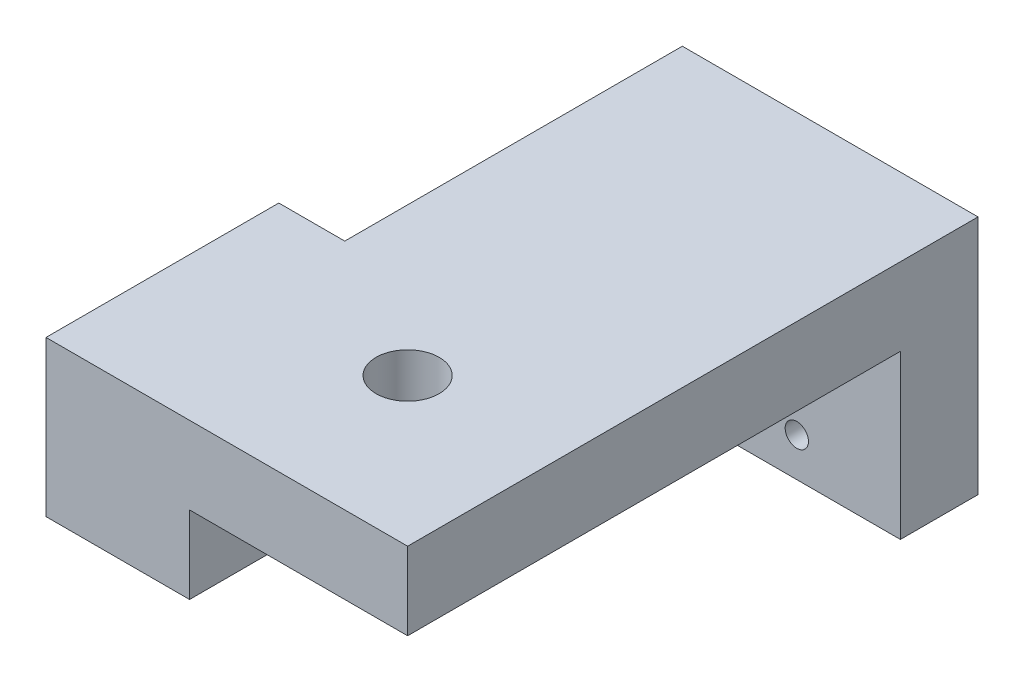
ISO-10303-21;
HEADER;
FILE_DESCRIPTION(('STEP AP214'),'2;1');
FILE_NAME('part.step','',(''),(''),'','','');
FILE_SCHEMA(('AUTOMOTIVE_DESIGN { 1 0 10303 214 1 1 1 1 }'));
ENDSEC;
DATA;
#1=APPLICATION_CONTEXT('core data for automotive mechanical design processes');
#2=APPLICATION_PROTOCOL_DEFINITION('international standard','automotive_design',2000,#1);
#3=PRODUCT_CONTEXT('',#1,'mechanical');
#4=PRODUCT('Part','Part','',(#3));
#5=PRODUCT_RELATED_PRODUCT_CATEGORY('part','',(#4));
#6=PRODUCT_DEFINITION_FORMATION('','',#4);
#7=PRODUCT_DEFINITION_CONTEXT('part definition',#1,'design');
#8=PRODUCT_DEFINITION('design','',#6,#7);
#9=PRODUCT_DEFINITION_SHAPE('','',#8);
#10=(LENGTH_UNIT() NAMED_UNIT(*) SI_UNIT(.MILLI.,.METRE.));
#11=(NAMED_UNIT(*) PLANE_ANGLE_UNIT() SI_UNIT($,.RADIAN.));
#12=(NAMED_UNIT(*) SI_UNIT($,.STERADIAN.) SOLID_ANGLE_UNIT());
#13=UNCERTAINTY_MEASURE_WITH_UNIT(LENGTH_MEASURE(1.E-05),#10,'distance_accuracy_value','');
#14=(GEOMETRIC_REPRESENTATION_CONTEXT(3) GLOBAL_UNCERTAINTY_ASSIGNED_CONTEXT((#13)) GLOBAL_UNIT_ASSIGNED_CONTEXT((#10,
#11,#12)) REPRESENTATION_CONTEXT('',''));
#15=CARTESIAN_POINT('',(0.,0.,0.));
#16=DIRECTION('',(0.,0.,1.));
#17=DIRECTION('',(1.,0.,0.));
#18=AXIS2_PLACEMENT_3D('',#15,#16,#17);
#19=CARTESIAN_POINT('',(0.,10.,0.));
#20=DIRECTION('',(0.,1.,0.));
#21=DIRECTION('',(0.,0.,1.));
#22=AXIS2_PLACEMENT_3D('',#19,#20,#21);
#23=PLANE('',#22);
#24=DIRECTION('',(0.,0.,1.));
#25=VECTOR('',#24,1.);
#26=CARTESIAN_POINT('',(0.,10.,0.));
#27=LINE('',#26,#25);
#28=CARTESIAN_POINT('',(0.,10.,-10.));
#29=VERTEX_POINT('',#28);
#30=CARTESIAN_POINT('',(0.,10.,33.5));
#31=VERTEX_POINT('',#30);
#32=EDGE_CURVE('E259',#29,#31,#27,.T.);
#33=ORIENTED_EDGE('',*,*,#32,.T.);
#34=DIRECTION('',(1.,0.,0.));
#35=VECTOR('',#34,1.);
#36=CARTESIAN_POINT('',(-8.5,10.,33.5));
#37=LINE('',#36,#35);
#38=CARTESIAN_POINT('',(-8.5,10.,33.5));
#39=VERTEX_POINT('',#38);
#40=EDGE_CURVE('E73',#39,#31,#37,.T.);
#41=ORIENTED_EDGE('',*,*,#40,.F.);
#42=DIRECTION('',(0.,0.,1.));
#43=VECTOR('',#42,1.);
#44=CARTESIAN_POINT('',(-8.5,10.,63.5));
#45=LINE('',#44,#43);
#46=CARTESIAN_POINT('',(-8.5,10.,63.5));
#47=VERTEX_POINT('',#46);
#48=EDGE_CURVE('E240',#39,#47,#45,.T.);
#49=ORIENTED_EDGE('',*,*,#48,.T.);
#50=DIRECTION('',(1.,0.,0.));
#51=VECTOR('',#50,1.);
#52=CARTESIAN_POINT('',(0.,10.,63.5));
#53=LINE('',#52,#51);
#54=CARTESIAN_POINT('',(38.1,10.,63.5));
#55=VERTEX_POINT('',#54);
#56=EDGE_CURVE('E51',#47,#55,#53,.T.);
#57=ORIENTED_EDGE('',*,*,#56,.T.);
#58=DIRECTION('',(0.,0.,-1.));
#59=VECTOR('',#58,1.);
#60=CARTESIAN_POINT('',(38.1,10.,0.));
#61=LINE('',#60,#59);
#62=CARTESIAN_POINT('',(38.1,10.,-10.));
#63=VERTEX_POINT('',#62);
#64=EDGE_CURVE('E264',#55,#63,#61,.T.);
#65=ORIENTED_EDGE('',*,*,#64,.T.);
#66=DIRECTION('',(1.,0.,0.));
#67=VECTOR('',#66,1.);
#68=CARTESIAN_POINT('',(0.,10.,-10.));
#69=LINE('',#68,#67);
#70=EDGE_CURVE('E177',#29,#63,#69,.T.);
#71=ORIENTED_EDGE('',*,*,#70,.F.);
#72=EDGE_LOOP('',(#33,#41,#49,#57,#65,#71));
#73=FACE_BOUND('',#72,.T.);
#74=CARTESIAN_POINT('',(19.05,10.,44.45));
#75=DIRECTION('',(0.,1.,0.));
#76=DIRECTION('',(0.,0.,1.));
#77=AXIS2_PLACEMENT_3D('',#74,#75,#76);
#78=CIRCLE('',#77,4.064);
#79=CARTESIAN_POINT('',(19.05,10.,48.514));
#80=VERTEX_POINT('',#79);
#81=EDGE_CURVE('E253',#80,#80,#78,.T.);
#82=ORIENTED_EDGE('',*,*,#81,.F.);
#83=EDGE_LOOP('',(#82));
#84=FACE_BOUND('',#83,.T.);
#85=ADVANCED_FACE('F35',(#73,#84),#23,.T.);
#86=CARTESIAN_POINT('',(0.,0.,0.));
#87=DIRECTION('',(0.,1.,0.));
#88=DIRECTION('',(0.,0.,1.));
#89=AXIS2_PLACEMENT_3D('',#86,#87,#88);
#90=PLANE('',#89);
#91=DIRECTION('',(0.,0.,1.));
#92=VECTOR('',#91,1.);
#93=CARTESIAN_POINT('',(10.,0.,0.));
#94=LINE('',#93,#92);
#95=CARTESIAN_POINT('',(10.,0.,33.5));
#96=VERTEX_POINT('',#95);
#97=CARTESIAN_POINT('',(10.,0.,63.5));
#98=VERTEX_POINT('',#97);
#99=EDGE_CURVE('E244',#96,#98,#94,.T.);
#100=ORIENTED_EDGE('',*,*,#99,.F.);
#101=DIRECTION('',(-1.,0.,0.));
#102=VECTOR('',#101,1.);
#103=CARTESIAN_POINT('',(0.,0.,33.5));
#104=LINE('',#103,#102);
#105=CARTESIAN_POINT('',(0.,0.,33.5));
#106=VERTEX_POINT('',#105);
#107=EDGE_CURVE('E250',#96,#106,#104,.T.);
#108=ORIENTED_EDGE('',*,*,#107,.T.);
#109=DIRECTION('',(0.,0.,1.));
#110=VECTOR('',#109,1.);
#111=CARTESIAN_POINT('',(0.,0.,0.));
#112=LINE('',#111,#110);
#113=CARTESIAN_POINT('',(0.,0.,0.));
#114=VERTEX_POINT('',#113);
#115=EDGE_CURVE('E256',#114,#106,#112,.T.);
#116=ORIENTED_EDGE('',*,*,#115,.F.);
#117=DIRECTION('',(-1.,0.,0.));
#118=VECTOR('',#117,1.);
#119=CARTESIAN_POINT('',(0.,0.,0.));
#120=LINE('',#119,#118);
#121=CARTESIAN_POINT('',(38.1,0.,0.));
#122=VERTEX_POINT('',#121);
#123=EDGE_CURVE('E262',#122,#114,#120,.T.);
#124=ORIENTED_EDGE('',*,*,#123,.F.);
#125=DIRECTION('',(0.,0.,-1.));
#126=VECTOR('',#125,1.);
#127=CARTESIAN_POINT('',(38.1,0.,0.));
#128=LINE('',#127,#126);
#129=CARTESIAN_POINT('',(38.1,0.,63.5));
#130=VERTEX_POINT('',#129);
#131=EDGE_CURVE('E269',#130,#122,#128,.T.);
#132=ORIENTED_EDGE('',*,*,#131,.F.);
#133=DIRECTION('',(1.,0.,0.));
#134=VECTOR('',#133,1.);
#135=CARTESIAN_POINT('',(0.,0.,63.5));
#136=LINE('',#135,#134);
#137=EDGE_CURVE('E62',#98,#130,#136,.T.);
#138=ORIENTED_EDGE('',*,*,#137,.F.);
#139=EDGE_LOOP('',(#100,#108,#116,#124,#132,#138));
#140=FACE_BOUND('',#139,.T.);
#141=CARTESIAN_POINT('',(19.05,0.,44.45));
#142=DIRECTION('',(0.,1.,0.));
#143=DIRECTION('',(0.,0.,1.));
#144=AXIS2_PLACEMENT_3D('',#141,#142,#143);
#145=CIRCLE('',#144,4.064);
#146=CARTESIAN_POINT('',(19.05,0.,48.514));
#147=VERTEX_POINT('',#146);
#148=EDGE_CURVE('E252',#147,#147,#145,.T.);
#149=ORIENTED_EDGE('',*,*,#148,.T.);
#150=EDGE_LOOP('',(#149));
#151=FACE_BOUND('',#150,.T.);
#152=ADVANCED_FACE('F280',(#140,#151),#90,.F.);
#153=CARTESIAN_POINT('',(0.,10.,0.));
#154=DIRECTION('',(1.,0.,0.));
#155=DIRECTION('',(0.,0.,-1.));
#156=AXIS2_PLACEMENT_3D('',#153,#154,#155);
#157=PLANE('',#156);
#158=ORIENTED_EDGE('',*,*,#115,.T.);
#159=DIRECTION('',(0.,1.,0.));
#160=VECTOR('',#159,1.);
#161=CARTESIAN_POINT('',(0.,10.,33.5));
#162=LINE('',#161,#160);
#163=EDGE_CURVE('E11',#106,#31,#162,.T.);
#164=ORIENTED_EDGE('',*,*,#163,.T.);
#165=ORIENTED_EDGE('',*,*,#32,.F.);
#166=DIRECTION('',(0.,-1.,0.));
#167=VECTOR('',#166,1.);
#168=CARTESIAN_POINT('',(0.,0.,-10.));
#169=LINE('',#168,#167);
#170=CARTESIAN_POINT('',(0.,-21.,-10.));
#171=VERTEX_POINT('',#170);
#172=EDGE_CURVE('E180',#29,#171,#169,.T.);
#173=ORIENTED_EDGE('',*,*,#172,.T.);
#174=DIRECTION('',(0.,0.,1.));
#175=VECTOR('',#174,1.);
#176=CARTESIAN_POINT('',(0.,-21.,-10.));
#177=LINE('',#176,#175);
#178=CARTESIAN_POINT('',(0.,-21.,0.));
#179=VERTEX_POINT('',#178);
#180=EDGE_CURVE('E210',#171,#179,#177,.T.);
#181=ORIENTED_EDGE('',*,*,#180,.T.);
#182=DIRECTION('',(0.,-1.,0.));
#183=VECTOR('',#182,1.);
#184=CARTESIAN_POINT('',(0.,0.,0.));
#185=LINE('',#184,#183);
#186=EDGE_CURVE('E200',#114,#179,#185,.T.);
#187=ORIENTED_EDGE('',*,*,#186,.F.);
#188=EDGE_LOOP('',(#158,#164,#165,#173,#181,#187));
#189=FACE_BOUND('',#188,.T.);
#190=ADVANCED_FACE('F37',(#189),#157,.F.);
#191=CARTESIAN_POINT('',(0.,10.,63.5));
#192=DIRECTION('',(0.,0.,-1.));
#193=DIRECTION('',(-1.,0.,0.));
#194=AXIS2_PLACEMENT_3D('',#191,#192,#193);
#195=PLANE('',#194);
#196=DIRECTION('',(0.,-1.,0.));
#197=VECTOR('',#196,1.);
#198=CARTESIAN_POINT('',(10.,0.,63.5));
#199=LINE('',#198,#197);
#200=CARTESIAN_POINT('',(10.,-10.,63.5));
#201=VERTEX_POINT('',#200);
#202=EDGE_CURVE('E219',#98,#201,#199,.T.);
#203=ORIENTED_EDGE('',*,*,#202,.F.);
#204=ORIENTED_EDGE('',*,*,#137,.T.);
#205=DIRECTION('',(0.,-1.,0.));
#206=VECTOR('',#205,1.);
#207=CARTESIAN_POINT('',(38.1,10.,63.5));
#208=LINE('',#207,#206);
#209=EDGE_CURVE('E44',#55,#130,#208,.T.);
#210=ORIENTED_EDGE('',*,*,#209,.F.);
#211=ORIENTED_EDGE('',*,*,#56,.F.);
#212=DIRECTION('',(0.,-1.,0.));
#213=VECTOR('',#212,1.);
#214=CARTESIAN_POINT('',(-8.5,0.,63.5));
#215=LINE('',#214,#213);
#216=CARTESIAN_POINT('',(-8.5,-10.,63.5));
#217=VERTEX_POINT('',#216);
#218=EDGE_CURVE('E233',#47,#217,#215,.T.);
#219=ORIENTED_EDGE('',*,*,#218,.T.);
#220=DIRECTION('',(1.,0.,0.));
#221=VECTOR('',#220,1.);
#222=CARTESIAN_POINT('',(-8.5,-10.,63.5));
#223=LINE('',#222,#221);
#224=EDGE_CURVE('E242',#217,#201,#223,.T.);
#225=ORIENTED_EDGE('',*,*,#224,.T.);
#226=EDGE_LOOP('',(#203,#204,#210,#211,#219,#225));
#227=FACE_BOUND('',#226,.T.);
#228=ADVANCED_FACE('F317',(#227),#195,.F.);
#229=CARTESIAN_POINT('',(38.1,10.,0.));
#230=DIRECTION('',(-1.,0.,0.));
#231=DIRECTION('',(0.,0.,1.));
#232=AXIS2_PLACEMENT_3D('',#229,#230,#231);
#233=PLANE('',#232);
#234=ORIENTED_EDGE('',*,*,#131,.T.);
#235=DIRECTION('',(0.,-1.,0.));
#236=VECTOR('',#235,1.);
#237=CARTESIAN_POINT('',(38.1,0.,0.));
#238=LINE('',#237,#236);
#239=CARTESIAN_POINT('',(38.1,-21.,0.));
#240=VERTEX_POINT('',#239);
#241=EDGE_CURVE('E197',#122,#240,#238,.T.);
#242=ORIENTED_EDGE('',*,*,#241,.T.);
#243=DIRECTION('',(0.,0.,1.));
#244=VECTOR('',#243,1.);
#245=CARTESIAN_POINT('',(38.1,-21.,-10.));
#246=LINE('',#245,#244);
#247=CARTESIAN_POINT('',(38.1,-21.,-10.));
#248=VERTEX_POINT('',#247);
#249=EDGE_CURVE('E213',#248,#240,#246,.T.);
#250=ORIENTED_EDGE('',*,*,#249,.F.);
#251=DIRECTION('',(0.,-1.,0.));
#252=VECTOR('',#251,1.);
#253=CARTESIAN_POINT('',(38.1,0.,-10.));
#254=LINE('',#253,#252);
#255=EDGE_CURVE('E174',#63,#248,#254,.T.);
#256=ORIENTED_EDGE('',*,*,#255,.F.);
#257=ORIENTED_EDGE('',*,*,#64,.F.);
#258=ORIENTED_EDGE('',*,*,#209,.T.);
#259=EDGE_LOOP('',(#234,#242,#250,#256,#257,#258));
#260=FACE_BOUND('',#259,.T.);
#261=ADVANCED_FACE('F275',(#260),#233,.F.);
#262=CARTESIAN_POINT('',(19.05,10.,44.45));
#263=DIRECTION('',(0.,-1.,0.));
#264=DIRECTION('',(0.,0.,-1.));
#265=AXIS2_PLACEMENT_3D('',#262,#263,#264);
#266=CYLINDRICAL_SURFACE('',#265,4.064);
#267=ORIENTED_EDGE('',*,*,#81,.T.);
#268=EDGE_LOOP('',(#267));
#269=FACE_BOUND('',#268,.T.);
#270=ORIENTED_EDGE('',*,*,#148,.F.);
#271=EDGE_LOOP('',(#270));
#272=FACE_BOUND('',#271,.T.);
#273=ADVANCED_FACE('F306',(#269,#272),#266,.F.);
#274=CARTESIAN_POINT('',(-8.5,10.,33.5));
#275=DIRECTION('',(0.,0.,-1.));
#276=DIRECTION('',(-1.,0.,0.));
#277=AXIS2_PLACEMENT_3D('',#274,#275,#276);
#278=PLANE('',#277);
#279=ORIENTED_EDGE('',*,*,#107,.F.);
#280=DIRECTION('',(0.,1.,0.));
#281=VECTOR('',#280,1.);
#282=CARTESIAN_POINT('',(10.,0.,33.5));
#283=LINE('',#282,#281);
#284=CARTESIAN_POINT('',(10.,-10.,33.5));
#285=VERTEX_POINT('',#284);
#286=EDGE_CURVE('E224',#285,#96,#283,.T.);
#287=ORIENTED_EDGE('',*,*,#286,.F.);
#288=DIRECTION('',(1.,0.,0.));
#289=VECTOR('',#288,1.);
#290=CARTESIAN_POINT('',(-8.5,-10.,33.5));
#291=LINE('',#290,#289);
#292=CARTESIAN_POINT('',(-8.5,-10.,33.5));
#293=VERTEX_POINT('',#292);
#294=EDGE_CURVE('E245',#293,#285,#291,.T.);
#295=ORIENTED_EDGE('',*,*,#294,.F.);
#296=DIRECTION('',(0.,1.,0.));
#297=VECTOR('',#296,1.);
#298=CARTESIAN_POINT('',(-8.5,0.,33.5));
#299=LINE('',#298,#297);
#300=EDGE_CURVE('E238',#293,#39,#299,.T.);
#301=ORIENTED_EDGE('',*,*,#300,.T.);
#302=ORIENTED_EDGE('',*,*,#40,.T.);
#303=ORIENTED_EDGE('',*,*,#163,.F.);
#304=EDGE_LOOP('',(#279,#287,#295,#301,#302,#303));
#305=FACE_BOUND('',#304,.T.);
#306=ADVANCED_FACE('F309',(#305),#278,.T.);
#307=CARTESIAN_POINT('',(-8.5,8.,59.6));
#308=DIRECTION('',(1.,0.,0.));
#309=DIRECTION('',(0.,0.,-1.));
#310=AXIS2_PLACEMENT_3D('',#307,#308,#309);
#311=CYLINDRICAL_SURFACE('',#310,1.5);
#312=CARTESIAN_POINT('',(-8.5,8.,59.6));
#313=DIRECTION('',(1.,0.,0.));
#314=DIRECTION('',(0.,0.,-1.));
#315=AXIS2_PLACEMENT_3D('',#312,#313,#314);
#316=CIRCLE('',#315,1.5);
#317=CARTESIAN_POINT('',(-8.5,8.,58.1));
#318=VERTEX_POINT('',#317);
#319=EDGE_CURVE('E230',#318,#318,#316,.T.);
#320=ORIENTED_EDGE('',*,*,#319,.F.);
#321=EDGE_LOOP('',(#320));
#322=FACE_BOUND('',#321,.T.);
#323=CARTESIAN_POINT('',(10.,8.,59.6));
#324=DIRECTION('',(1.,0.,0.));
#325=DIRECTION('',(0.,0.,-1.));
#326=AXIS2_PLACEMENT_3D('',#323,#324,#325);
#327=CIRCLE('',#326,1.5);
#328=CARTESIAN_POINT('',(10.,8.,58.1));
#329=VERTEX_POINT('',#328);
#330=EDGE_CURVE('E188',#329,#329,#327,.T.);
#331=ORIENTED_EDGE('',*,*,#330,.T.);
#332=EDGE_LOOP('',(#331));
#333=FACE_BOUND('',#332,.T.);
#334=ADVANCED_FACE('F345',(#322,#333),#311,.F.);
#335=CARTESIAN_POINT('',(10.,0.,0.));
#336=DIRECTION('',(-1.,0.,0.));
#337=DIRECTION('',(0.,0.,1.));
#338=AXIS2_PLACEMENT_3D('',#335,#336,#337);
#339=PLANE('',#338);
#340=CARTESIAN_POINT('',(10.,-2.3,37.4));
#341=DIRECTION('',(1.,0.,0.));
#342=DIRECTION('',(0.,0.,-1.));
#343=AXIS2_PLACEMENT_3D('',#340,#341,#342);
#344=CIRCLE('',#343,1.5);
#345=CARTESIAN_POINT('',(10.,-2.3,35.9));
#346=VERTEX_POINT('',#345);
#347=EDGE_CURVE('E207',#346,#346,#344,.T.);
#348=ORIENTED_EDGE('',*,*,#347,.F.);
#349=EDGE_LOOP('',(#348));
#350=FACE_BOUND('',#349,.T.);
#351=ORIENTED_EDGE('',*,*,#286,.T.);
#352=ORIENTED_EDGE('',*,*,#99,.T.);
#353=ORIENTED_EDGE('',*,*,#202,.T.);
#354=DIRECTION('',(0.,0.,-1.));
#355=VECTOR('',#354,1.);
#356=CARTESIAN_POINT('',(10.,-10.,33.5));
#357=LINE('',#356,#355);
#358=EDGE_CURVE('E221',#201,#285,#357,.T.);
#359=ORIENTED_EDGE('',*,*,#358,.T.);
#360=EDGE_LOOP('',(#351,#352,#353,#359));
#361=FACE_BOUND('',#360,.T.);
#362=ADVANCED_FACE('F326',(#350,#361),#339,.F.);
#363=CARTESIAN_POINT('',(-8.5,-10.,33.5));
#364=DIRECTION('',(0.,-1.,0.));
#365=DIRECTION('',(0.,0.,-1.));
#366=AXIS2_PLACEMENT_3D('',#363,#364,#365);
#367=PLANE('',#366);
#368=ORIENTED_EDGE('',*,*,#294,.T.);
#369=ORIENTED_EDGE('',*,*,#358,.F.);
#370=ORIENTED_EDGE('',*,*,#224,.F.);
#371=DIRECTION('',(0.,0.,-1.));
#372=VECTOR('',#371,1.);
#373=CARTESIAN_POINT('',(-8.5,-10.,33.5));
#374=LINE('',#373,#372);
#375=EDGE_CURVE('E235',#217,#293,#374,.T.);
#376=ORIENTED_EDGE('',*,*,#375,.T.);
#377=EDGE_LOOP('',(#368,#369,#370,#376));
#378=FACE_BOUND('',#377,.T.);
#379=ADVANCED_FACE('F335',(#378),#367,.T.);
#380=CARTESIAN_POINT('',(-8.5,0.,0.));
#381=DIRECTION('',(-1.,0.,0.));
#382=DIRECTION('',(0.,0.,1.));
#383=AXIS2_PLACEMENT_3D('',#380,#381,#382);
#384=PLANE('',#383);
#385=CARTESIAN_POINT('',(-8.5,-2.3,37.4));
#386=DIRECTION('',(1.,0.,0.));
#387=DIRECTION('',(0.,0.,-1.));
#388=AXIS2_PLACEMENT_3D('',#385,#386,#387);
#389=CIRCLE('',#388,1.5);
#390=CARTESIAN_POINT('',(-8.5,-2.3,35.9));
#391=VERTEX_POINT('',#390);
#392=EDGE_CURVE('E227',#391,#391,#389,.T.);
#393=ORIENTED_EDGE('',*,*,#392,.T.);
#394=EDGE_LOOP('',(#393));
#395=FACE_BOUND('',#394,.T.);
#396=ORIENTED_EDGE('',*,*,#319,.T.);
#397=EDGE_LOOP('',(#396));
#398=FACE_BOUND('',#397,.T.);
#399=ORIENTED_EDGE('',*,*,#218,.F.);
#400=ORIENTED_EDGE('',*,*,#48,.F.);
#401=ORIENTED_EDGE('',*,*,#300,.F.);
#402=ORIENTED_EDGE('',*,*,#375,.F.);
#403=EDGE_LOOP('',(#399,#400,#401,#402));
#404=FACE_BOUND('',#403,.T.);
#405=ADVANCED_FACE('F334',(#395,#398,#404),#384,.T.);
#406=CARTESIAN_POINT('',(-8.5,-2.3,37.4));
#407=DIRECTION('',(1.,0.,0.));
#408=DIRECTION('',(0.,0.,-1.));
#409=AXIS2_PLACEMENT_3D('',#406,#407,#408);
#410=CYLINDRICAL_SURFACE('',#409,1.5);
#411=ORIENTED_EDGE('',*,*,#392,.F.);
#412=EDGE_LOOP('',(#411));
#413=FACE_BOUND('',#412,.T.);
#414=ORIENTED_EDGE('',*,*,#347,.T.);
#415=EDGE_LOOP('',(#414));
#416=FACE_BOUND('',#415,.T.);
#417=ADVANCED_FACE('F342',(#413,#416),#410,.F.);
#418=CARTESIAN_POINT('',(0.,-3.,-10.));
#419=DIRECTION('',(0.,-1.,0.));
#420=DIRECTION('',(0.,0.,-1.));
#421=AXIS2_PLACEMENT_3D('',#418,#419,#420);
#422=PLANE('',#421);
#423=DIRECTION('',(1.,0.,0.));
#424=VECTOR('',#423,1.);
#425=CARTESIAN_POINT('',(0.,-3.,0.));
#426=LINE('',#425,#424);
#427=CARTESIAN_POINT('',(13.25,-3.,0.));
#428=VERTEX_POINT('',#427);
#429=CARTESIAN_POINT('',(16.25,-3.,0.));
#430=VERTEX_POINT('',#429);
#431=EDGE_CURVE('E191',#428,#430,#426,.T.);
#432=ORIENTED_EDGE('',*,*,#431,.F.);
#433=DIRECTION('',(0.,0.,1.));
#434=VECTOR('',#433,1.);
#435=CARTESIAN_POINT('',(13.25,-3.,-10.));
#436=LINE('',#435,#434);
#437=CARTESIAN_POINT('',(13.25,-3.,-10.));
#438=VERTEX_POINT('',#437);
#439=EDGE_CURVE('E165',#438,#428,#436,.T.);
#440=ORIENTED_EDGE('',*,*,#439,.F.);
#441=DIRECTION('',(1.,0.,0.));
#442=VECTOR('',#441,1.);
#443=CARTESIAN_POINT('',(0.,-3.,-10.));
#444=LINE('',#443,#442);
#445=CARTESIAN_POINT('',(16.25,-3.,-10.));
#446=VERTEX_POINT('',#445);
#447=EDGE_CURVE('E159',#438,#446,#444,.T.);
#448=ORIENTED_EDGE('',*,*,#447,.T.);
#449=DIRECTION('',(0.,0.,1.));
#450=VECTOR('',#449,1.);
#451=CARTESIAN_POINT('',(16.25,-3.,-10.));
#452=LINE('',#451,#450);
#453=EDGE_CURVE('E141',#446,#430,#452,.T.);
#454=ORIENTED_EDGE('',*,*,#453,.T.);
#455=EDGE_LOOP('',(#432,#440,#448,#454));
#456=FACE_BOUND('',#455,.T.);
#457=ADVANCED_FACE('F164',(#456),#422,.T.);
#458=CARTESIAN_POINT('',(13.25,0.,-10.));
#459=DIRECTION('',(1.,0.,0.));
#460=DIRECTION('',(0.,0.,-1.));
#461=AXIS2_PLACEMENT_3D('',#458,#459,#460);
#462=PLANE('',#461);
#463=DIRECTION('',(0.,1.,0.));
#464=VECTOR('',#463,1.);
#465=CARTESIAN_POINT('',(13.25,0.,0.));
#466=LINE('',#465,#464);
#467=CARTESIAN_POINT('',(13.25,-21.,0.));
#468=VERTEX_POINT('',#467);
#469=EDGE_CURVE('E202',#468,#428,#466,.T.);
#470=ORIENTED_EDGE('',*,*,#469,.F.);
#471=DIRECTION('',(0.,0.,1.));
#472=VECTOR('',#471,1.);
#473=CARTESIAN_POINT('',(13.25,-21.,-10.));
#474=LINE('',#473,#472);
#475=CARTESIAN_POINT('',(13.25,-21.,-10.));
#476=VERTEX_POINT('',#475);
#477=EDGE_CURVE('E208',#476,#468,#474,.T.);
#478=ORIENTED_EDGE('',*,*,#477,.F.);
#479=DIRECTION('',(0.,1.,0.));
#480=VECTOR('',#479,1.);
#481=CARTESIAN_POINT('',(13.25,0.,-10.));
#482=LINE('',#481,#480);
#483=EDGE_CURVE('E152',#476,#438,#482,.T.);
#484=ORIENTED_EDGE('',*,*,#483,.T.);
#485=ORIENTED_EDGE('',*,*,#439,.T.);
#486=EDGE_LOOP('',(#470,#478,#484,#485));
#487=FACE_BOUND('',#486,.T.);
#488=ADVANCED_FACE('F294',(#487),#462,.T.);
#489=CARTESIAN_POINT('',(0.,-21.,-10.));
#490=DIRECTION('',(0.,-1.,0.));
#491=DIRECTION('',(0.,0.,-1.));
#492=AXIS2_PLACEMENT_3D('',#489,#490,#491);
#493=PLANE('',#492);
#494=DIRECTION('',(1.,0.,0.));
#495=VECTOR('',#494,1.);
#496=CARTESIAN_POINT('',(0.,-21.,0.));
#497=LINE('',#496,#495);
#498=EDGE_CURVE('E198',#179,#468,#497,.T.);
#499=ORIENTED_EDGE('',*,*,#498,.F.);
#500=ORIENTED_EDGE('',*,*,#180,.F.);
#501=DIRECTION('',(1.,0.,0.));
#502=VECTOR('',#501,1.);
#503=CARTESIAN_POINT('',(0.,-21.,-10.));
#504=LINE('',#503,#502);
#505=EDGE_CURVE('E175',#171,#476,#504,.T.);
#506=ORIENTED_EDGE('',*,*,#505,.T.);
#507=ORIENTED_EDGE('',*,*,#477,.T.);
#508=EDGE_LOOP('',(#499,#500,#506,#507));
#509=FACE_BOUND('',#508,.T.);
#510=ADVANCED_FACE('F377',(#509),#493,.T.);
#511=CARTESIAN_POINT('',(16.25,-21.,0.));
#512=VERTEX_POINT('',#511);
#513=EDGE_CURVE('E194',#512,#240,#497,.T.);
#514=ORIENTED_EDGE('',*,*,#513,.F.);
#515=DIRECTION('',(0.,0.,1.));
#516=VECTOR('',#515,1.);
#517=CARTESIAN_POINT('',(16.25,-21.,-10.));
#518=LINE('',#517,#516);
#519=CARTESIAN_POINT('',(16.25,-21.,-10.));
#520=VERTEX_POINT('',#519);
#521=EDGE_CURVE('E151',#520,#512,#518,.T.);
#522=ORIENTED_EDGE('',*,*,#521,.F.);
#523=EDGE_CURVE('E162',#520,#248,#504,.T.);
#524=ORIENTED_EDGE('',*,*,#523,.T.);
#525=ORIENTED_EDGE('',*,*,#249,.T.);
#526=EDGE_LOOP('',(#514,#522,#524,#525));
#527=FACE_BOUND('',#526,.T.);
#528=ADVANCED_FACE('F289',(#527),#493,.T.);
#529=CARTESIAN_POINT('',(4.75,4.,-10.));
#530=DIRECTION('',(0.,0.,1.));
#531=DIRECTION('',(1.,0.,0.));
#532=AXIS2_PLACEMENT_3D('',#529,#530,#531);
#533=CYLINDRICAL_SURFACE('',#532,1.5);
#534=CARTESIAN_POINT('',(4.75,4.,-10.));
#535=DIRECTION('',(0.,0.,1.));
#536=DIRECTION('',(1.,0.,0.));
#537=AXIS2_PLACEMENT_3D('',#534,#535,#536);
#538=CIRCLE('',#537,1.5);
#539=CARTESIAN_POINT('',(6.25,4.,-10.));
#540=VERTEX_POINT('',#539);
#541=EDGE_CURVE('E166',#540,#540,#538,.T.);
#542=ORIENTED_EDGE('',*,*,#541,.F.);
#543=EDGE_LOOP('',(#542));
#544=FACE_BOUND('',#543,.T.);
#545=CARTESIAN_POINT('',(4.75,4.,10.));
#546=DIRECTION('',(0.,0.,1.));
#547=DIRECTION('',(1.,0.,0.));
#548=AXIS2_PLACEMENT_3D('',#545,#546,#547);
#549=CIRCLE('',#548,1.5);
#550=CARTESIAN_POINT('',(6.25,4.,10.));
#551=VERTEX_POINT('',#550);
#552=EDGE_CURVE('E405',#551,#551,#549,.T.);
#553=ORIENTED_EDGE('',*,*,#552,.T.);
#554=EDGE_LOOP('',(#553));
#555=FACE_BOUND('',#554,.T.);
#556=ADVANCED_FACE('F368',(#544,#555),#533,.F.);
#557=CARTESIAN_POINT('',(24.75,4.,-10.));
#558=DIRECTION('',(0.,0.,1.));
#559=DIRECTION('',(1.,0.,0.));
#560=AXIS2_PLACEMENT_3D('',#557,#558,#559);
#561=CYLINDRICAL_SURFACE('',#560,1.5);
#562=CARTESIAN_POINT('',(24.75,4.,-10.));
#563=DIRECTION('',(0.,0.,1.));
#564=DIRECTION('',(1.,0.,0.));
#565=AXIS2_PLACEMENT_3D('',#562,#563,#564);
#566=CIRCLE('',#565,1.5);
#567=CARTESIAN_POINT('',(26.25,4.,-10.));
#568=VERTEX_POINT('',#567);
#569=EDGE_CURVE('E169',#568,#568,#566,.T.);
#570=ORIENTED_EDGE('',*,*,#569,.F.);
#571=EDGE_LOOP('',(#570));
#572=FACE_BOUND('',#571,.T.);
#573=CARTESIAN_POINT('',(24.75,4.,10.));
#574=DIRECTION('',(0.,0.,1.));
#575=DIRECTION('',(1.,0.,0.));
#576=AXIS2_PLACEMENT_3D('',#573,#574,#575);
#577=CIRCLE('',#576,1.5);
#578=CARTESIAN_POINT('',(26.25,4.,10.));
#579=VERTEX_POINT('',#578);
#580=EDGE_CURVE('E403',#579,#579,#577,.T.);
#581=ORIENTED_EDGE('',*,*,#580,.T.);
#582=EDGE_LOOP('',(#581));
#583=FACE_BOUND('',#582,.T.);
#584=ADVANCED_FACE('F364',(#572,#583),#561,.F.);
#585=CARTESIAN_POINT('',(24.75,-16.,-10.));
#586=DIRECTION('',(0.,0.,1.));
#587=DIRECTION('',(1.,0.,0.));
#588=AXIS2_PLACEMENT_3D('',#585,#586,#587);
#589=CYLINDRICAL_SURFACE('',#588,1.5);
#590=CARTESIAN_POINT('',(24.75,-16.,-10.));
#591=DIRECTION('',(0.,0.,1.));
#592=DIRECTION('',(1.,0.,0.));
#593=AXIS2_PLACEMENT_3D('',#590,#591,#592);
#594=CIRCLE('',#593,1.5);
#595=CARTESIAN_POINT('',(26.25,-16.,-10.));
#596=VERTEX_POINT('',#595);
#597=EDGE_CURVE('E414',#596,#596,#594,.T.);
#598=ORIENTED_EDGE('',*,*,#597,.F.);
#599=EDGE_LOOP('',(#598));
#600=FACE_BOUND('',#599,.T.);
#601=CARTESIAN_POINT('',(24.75,-16.,0.));
#602=DIRECTION('',(0.,0.,1.));
#603=DIRECTION('',(1.,0.,0.));
#604=AXIS2_PLACEMENT_3D('',#601,#602,#603);
#605=CIRCLE('',#604,1.5);
#606=CARTESIAN_POINT('',(26.25,-16.,0.));
#607=VERTEX_POINT('',#606);
#608=EDGE_CURVE('E187',#607,#607,#605,.T.);
#609=ORIENTED_EDGE('',*,*,#608,.T.);
#610=EDGE_LOOP('',(#609));
#611=FACE_BOUND('',#610,.T.);
#612=ADVANCED_FACE('F360',(#600,#611),#589,.F.);
#613=CARTESIAN_POINT('',(4.75,-16.,-10.));
#614=DIRECTION('',(0.,0.,1.));
#615=DIRECTION('',(1.,0.,0.));
#616=AXIS2_PLACEMENT_3D('',#613,#614,#615);
#617=CYLINDRICAL_SURFACE('',#616,1.5);
#618=CARTESIAN_POINT('',(4.75,-16.,-10.));
#619=DIRECTION('',(0.,0.,1.));
#620=DIRECTION('',(1.,0.,0.));
#621=AXIS2_PLACEMENT_3D('',#618,#619,#620);
#622=CIRCLE('',#621,1.5);
#623=CARTESIAN_POINT('',(6.25,-16.,-10.));
#624=VERTEX_POINT('',#623);
#625=EDGE_CURVE('E205',#624,#624,#622,.T.);
#626=ORIENTED_EDGE('',*,*,#625,.F.);
#627=EDGE_LOOP('',(#626));
#628=FACE_BOUND('',#627,.T.);
#629=CARTESIAN_POINT('',(4.75,-16.,0.));
#630=DIRECTION('',(0.,0.,1.));
#631=DIRECTION('',(1.,0.,0.));
#632=AXIS2_PLACEMENT_3D('',#629,#630,#631);
#633=CIRCLE('',#632,1.5);
#634=CARTESIAN_POINT('',(6.25,-16.,0.));
#635=VERTEX_POINT('',#634);
#636=EDGE_CURVE('E184',#635,#635,#633,.T.);
#637=ORIENTED_EDGE('',*,*,#636,.T.);
#638=EDGE_LOOP('',(#637));
#639=FACE_BOUND('',#638,.T.);
#640=ADVANCED_FACE('F357',(#628,#639),#617,.F.);
#641=CARTESIAN_POINT('',(16.25,0.,-10.));
#642=DIRECTION('',(-1.,0.,0.));
#643=DIRECTION('',(0.,0.,1.));
#644=AXIS2_PLACEMENT_3D('',#641,#642,#643);
#645=PLANE('',#644);
#646=DIRECTION('',(0.,-1.,0.));
#647=VECTOR('',#646,1.);
#648=CARTESIAN_POINT('',(16.25,0.,0.));
#649=LINE('',#648,#647);
#650=EDGE_CURVE('E146',#430,#512,#649,.T.);
#651=ORIENTED_EDGE('',*,*,#650,.F.);
#652=ORIENTED_EDGE('',*,*,#453,.F.);
#653=DIRECTION('',(0.,-1.,0.));
#654=VECTOR('',#653,1.);
#655=CARTESIAN_POINT('',(16.25,0.,-10.));
#656=LINE('',#655,#654);
#657=EDGE_CURVE('E144',#446,#520,#656,.T.);
#658=ORIENTED_EDGE('',*,*,#657,.T.);
#659=ORIENTED_EDGE('',*,*,#521,.T.);
#660=EDGE_LOOP('',(#651,#652,#658,#659));
#661=FACE_BOUND('',#660,.T.);
#662=ADVANCED_FACE('F143',(#661),#645,.T.);
#663=CARTESIAN_POINT('',(0.,0.,-10.));
#664=DIRECTION('',(0.,0.,1.));
#665=DIRECTION('',(1.,0.,0.));
#666=AXIS2_PLACEMENT_3D('',#663,#664,#665);
#667=PLANE('',#666);
#668=ORIENTED_EDGE('',*,*,#625,.T.);
#669=EDGE_LOOP('',(#668));
#670=FACE_BOUND('',#669,.T.);
#671=ORIENTED_EDGE('',*,*,#597,.T.);
#672=EDGE_LOOP('',(#671));
#673=FACE_BOUND('',#672,.T.);
#674=ORIENTED_EDGE('',*,*,#569,.T.);
#675=EDGE_LOOP('',(#674));
#676=FACE_BOUND('',#675,.T.);
#677=ORIENTED_EDGE('',*,*,#541,.T.);
#678=EDGE_LOOP('',(#677));
#679=FACE_BOUND('',#678,.T.);
#680=ORIENTED_EDGE('',*,*,#447,.F.);
#681=ORIENTED_EDGE('',*,*,#483,.F.);
#682=ORIENTED_EDGE('',*,*,#505,.F.);
#683=ORIENTED_EDGE('',*,*,#172,.F.);
#684=ORIENTED_EDGE('',*,*,#70,.T.);
#685=ORIENTED_EDGE('',*,*,#255,.T.);
#686=ORIENTED_EDGE('',*,*,#523,.F.);
#687=ORIENTED_EDGE('',*,*,#657,.F.);
#688=EDGE_LOOP('',(#680,#681,#682,#683,#684,#685,#686,#687));
#689=FACE_BOUND('',#688,.T.);
#690=ADVANCED_FACE('F157',(#670,#673,#676,#679,#689),#667,.F.);
#691=CARTESIAN_POINT('',(0.,0.,0.));
#692=DIRECTION('',(0.,0.,1.));
#693=DIRECTION('',(1.,0.,0.));
#694=AXIS2_PLACEMENT_3D('',#691,#692,#693);
#695=PLANE('',#694);
#696=ORIENTED_EDGE('',*,*,#636,.F.);
#697=EDGE_LOOP('',(#696));
#698=FACE_BOUND('',#697,.T.);
#699=ORIENTED_EDGE('',*,*,#608,.F.);
#700=EDGE_LOOP('',(#699));
#701=FACE_BOUND('',#700,.T.);
#702=ORIENTED_EDGE('',*,*,#241,.F.);
#703=ORIENTED_EDGE('',*,*,#123,.T.);
#704=ORIENTED_EDGE('',*,*,#186,.T.);
#705=ORIENTED_EDGE('',*,*,#498,.T.);
#706=ORIENTED_EDGE('',*,*,#469,.T.);
#707=ORIENTED_EDGE('',*,*,#431,.T.);
#708=ORIENTED_EDGE('',*,*,#650,.T.);
#709=ORIENTED_EDGE('',*,*,#513,.T.);
#710=EDGE_LOOP('',(#702,#703,#704,#705,#706,#707,#708,#709));
#711=FACE_BOUND('',#710,.T.);
#712=ADVANCED_FACE('F285',(#698,#701,#711),#695,.T.);
#713=CARTESIAN_POINT('',(10.,0.,0.));
#714=DIRECTION('',(1.,0.,0.));
#715=DIRECTION('',(0.,0.,-1.));
#716=AXIS2_PLACEMENT_3D('',#713,#714,#715);
#717=PLANE('',#716);
#718=ORIENTED_EDGE('',*,*,#330,.F.);
#719=EDGE_LOOP('',(#718));
#720=FACE_BOUND('',#719,.T.);
#721=ADVANCED_FACE('F384',(#720),#717,.F.);
#722=CARTESIAN_POINT('',(0.,0.,10.));
#723=DIRECTION('',(0.,0.,1.));
#724=DIRECTION('',(1.,0.,0.));
#725=AXIS2_PLACEMENT_3D('',#722,#723,#724);
#726=PLANE('',#725);
#727=ORIENTED_EDGE('',*,*,#580,.F.);
#728=EDGE_LOOP('',(#727));
#729=FACE_BOUND('',#728,.T.);
#730=ADVANCED_FACE('F391',(#729),#726,.F.);
#731=CARTESIAN_POINT('',(0.,0.,10.));
#732=DIRECTION('',(0.,0.,1.));
#733=DIRECTION('',(1.,0.,0.));
#734=AXIS2_PLACEMENT_3D('',#731,#732,#733);
#735=PLANE('',#734);
#736=ORIENTED_EDGE('',*,*,#552,.F.);
#737=EDGE_LOOP('',(#736));
#738=FACE_BOUND('',#737,.T.);
#739=ADVANCED_FACE('F393',(#738),#735,.F.);
#740=CLOSED_SHELL('',(#85,#152,#190,#228,#261,#273,#306,#334,#362,#379,#405,#417,#457,#488,#510,
#528,#556,#584,#612,#640,#662,#690,#712,#721,#730,#739));
#741=MANIFOLD_SOLID_BREP('B2',#740);
#742=ADVANCED_BREP_SHAPE_REPRESENTATION('',(#18,#741),#14);
#743=SHAPE_DEFINITION_REPRESENTATION(#9,#742);
ENDSEC;
END-ISO-10303-21;
